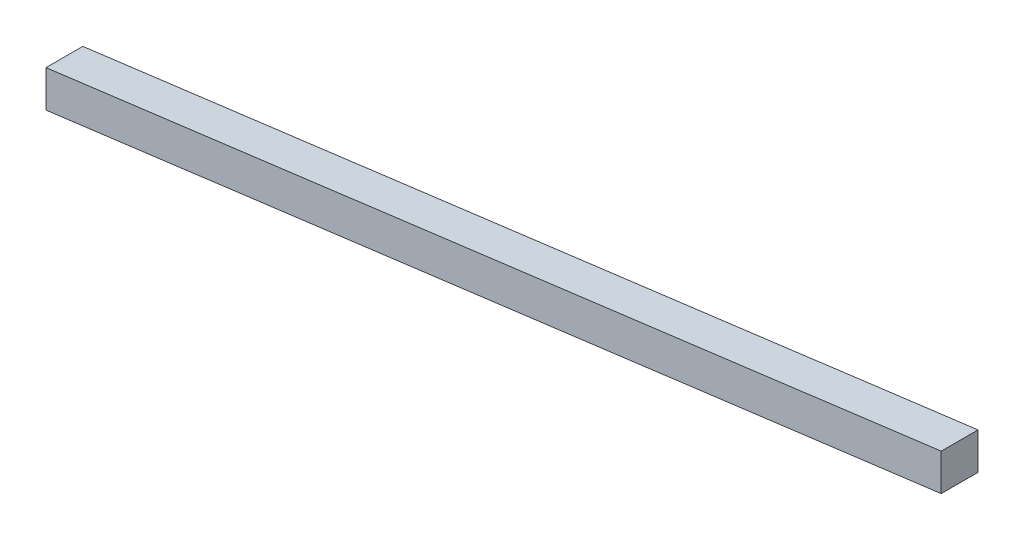
ISO-10303-21;
HEADER;
FILE_DESCRIPTION(('STEP AP214'),'2;1');
FILE_NAME('part.step','',(''),(''),'','','');
FILE_SCHEMA(('AUTOMOTIVE_DESIGN { 1 0 10303 214 1 1 1 1 }'));
ENDSEC;
DATA;
#1=APPLICATION_CONTEXT('core data for automotive mechanical design processes');
#2=APPLICATION_PROTOCOL_DEFINITION('international standard','automotive_design',2000,#1);
#3=PRODUCT_CONTEXT('',#1,'mechanical');
#4=PRODUCT('Part','Part','',(#3));
#5=PRODUCT_RELATED_PRODUCT_CATEGORY('part','',(#4));
#6=PRODUCT_DEFINITION_FORMATION('','',#4);
#7=PRODUCT_DEFINITION_CONTEXT('part definition',#1,'design');
#8=PRODUCT_DEFINITION('design','',#6,#7);
#9=PRODUCT_DEFINITION_SHAPE('','',#8);
#10=(LENGTH_UNIT() NAMED_UNIT(*) SI_UNIT(.MILLI.,.METRE.));
#11=(NAMED_UNIT(*) PLANE_ANGLE_UNIT() SI_UNIT($,.RADIAN.));
#12=(NAMED_UNIT(*) SI_UNIT($,.STERADIAN.) SOLID_ANGLE_UNIT());
#13=UNCERTAINTY_MEASURE_WITH_UNIT(LENGTH_MEASURE(1.E-05),#10,'distance_accuracy_value','');
#14=(GEOMETRIC_REPRESENTATION_CONTEXT(3) GLOBAL_UNCERTAINTY_ASSIGNED_CONTEXT((#13)) GLOBAL_UNIT_ASSIGNED_CONTEXT((#10,
#11,#12)) REPRESENTATION_CONTEXT('',''));
#15=CARTESIAN_POINT('',(0.,0.,0.));
#16=DIRECTION('',(0.,0.,1.));
#17=DIRECTION('',(1.,0.,0.));
#18=AXIS2_PLACEMENT_3D('',#15,#16,#17);
#19=CARTESIAN_POINT('',(73.0062499999999,12.4164000000002,6.));
#20=DIRECTION('',(-1.,0.,0.));
#21=DIRECTION('',(0.,0.,1.));
#22=AXIS2_PLACEMENT_3D('',#19,#20,#21);
#23=PLANE('',#22);
#24=DIRECTION('',(0.,1.,0.));
#25=VECTOR('',#24,1.);
#26=CARTESIAN_POINT('',(73.0062499999999,12.4164000000002,0.));
#27=LINE('',#26,#25);
#28=CARTESIAN_POINT('',(73.0062499999999,6.41640000000021,0.));
#29=VERTEX_POINT('',#28);
#30=CARTESIAN_POINT('',(73.0062499999999,12.4164000000002,0.));
#31=VERTEX_POINT('',#30);
#32=EDGE_CURVE('E113',#29,#31,#27,.T.);
#33=ORIENTED_EDGE('',*,*,#32,.T.);
#34=DIRECTION('',(0.,0.,-1.));
#35=VECTOR('',#34,1.);
#36=CARTESIAN_POINT('',(73.0062499999999,12.4164000000002,6.));
#37=LINE('',#36,#35);
#38=CARTESIAN_POINT('',(73.0062499999999,12.4164000000002,6.));
#39=VERTEX_POINT('',#38);
#40=EDGE_CURVE('E11',#39,#31,#37,.T.);
#41=ORIENTED_EDGE('',*,*,#40,.F.);
#42=DIRECTION('',(0.,1.,0.));
#43=VECTOR('',#42,1.);
#44=CARTESIAN_POINT('',(73.0062499999999,12.4164000000002,6.));
#45=LINE('',#44,#43);
#46=CARTESIAN_POINT('',(73.0062499999999,6.41640000000021,6.));
#47=VERTEX_POINT('',#46);
#48=EDGE_CURVE('E97',#47,#39,#45,.T.);
#49=ORIENTED_EDGE('',*,*,#48,.F.);
#50=DIRECTION('',(0.,0.,-1.));
#51=VECTOR('',#50,1.);
#52=CARTESIAN_POINT('',(73.0062499999999,6.41640000000021,6.));
#53=LINE('',#52,#51);
#54=EDGE_CURVE('E109',#47,#29,#53,.T.);
#55=ORIENTED_EDGE('',*,*,#54,.T.);
#56=EDGE_LOOP('',(#33,#41,#49,#55));
#57=FACE_BOUND('',#56,.T.);
#58=ADVANCED_FACE('F45',(#57),#23,.F.);
#59=CARTESIAN_POINT('',(-73.0062499999999,-6.41640000000021,6.));
#60=DIRECTION('',(0.127921077418863,-0.991784350527874,0.));
#61=DIRECTION('',(0.991784350527874,0.127921077418863,0.));
#62=AXIS2_PLACEMENT_3D('',#59,#60,#61);
#63=PLANE('',#62);
#64=DIRECTION('',(-0.991784350527874,-0.127921077418863,0.));
#65=VECTOR('',#64,1.);
#66=CARTESIAN_POINT('',(-73.0062499999999,-6.41640000000021,0.));
#67=LINE('',#66,#65);
#68=CARTESIAN_POINT('',(-73.0062499999999,-6.41640000000021,0.));
#69=VERTEX_POINT('',#68);
#70=EDGE_CURVE('E102',#31,#69,#67,.T.);
#71=ORIENTED_EDGE('',*,*,#70,.T.);
#72=DIRECTION('',(0.,0.,-1.));
#73=VECTOR('',#72,1.);
#74=CARTESIAN_POINT('',(-73.0062499999999,-6.41640000000021,6.));
#75=LINE('',#74,#73);
#76=CARTESIAN_POINT('',(-73.0062499999999,-6.41640000000021,6.));
#77=VERTEX_POINT('',#76);
#78=EDGE_CURVE('E54',#77,#69,#75,.T.);
#79=ORIENTED_EDGE('',*,*,#78,.F.);
#80=DIRECTION('',(-0.991784350527874,-0.127921077418863,0.));
#81=VECTOR('',#80,1.);
#82=CARTESIAN_POINT('',(-73.0062499999999,-6.41640000000021,6.));
#83=LINE('',#82,#81);
#84=EDGE_CURVE('E92',#39,#77,#83,.T.);
#85=ORIENTED_EDGE('',*,*,#84,.F.);
#86=ORIENTED_EDGE('',*,*,#40,.T.);
#87=EDGE_LOOP('',(#71,#79,#85,#86));
#88=FACE_BOUND('',#87,.T.);
#89=ADVANCED_FACE('F101',(#88),#63,.F.);
#90=CARTESIAN_POINT('',(-73.0062499999999,-12.4164000000002,6.));
#91=DIRECTION('',(1.,0.,0.));
#92=DIRECTION('',(0.,0.,-1.));
#93=AXIS2_PLACEMENT_3D('',#90,#91,#92);
#94=PLANE('',#93);
#95=DIRECTION('',(0.,-1.,0.));
#96=VECTOR('',#95,1.);
#97=CARTESIAN_POINT('',(-73.0062499999999,-12.4164000000002,0.));
#98=LINE('',#97,#96);
#99=CARTESIAN_POINT('',(-73.0062499999999,-12.4164000000002,0.));
#100=VERTEX_POINT('',#99);
#101=EDGE_CURVE('E79',#69,#100,#98,.T.);
#102=ORIENTED_EDGE('',*,*,#101,.T.);
#103=DIRECTION('',(0.,0.,-1.));
#104=VECTOR('',#103,1.);
#105=CARTESIAN_POINT('',(-73.0062499999999,-12.4164000000002,6.));
#106=LINE('',#105,#104);
#107=CARTESIAN_POINT('',(-73.0062499999999,-12.4164000000002,6.));
#108=VERTEX_POINT('',#107);
#109=EDGE_CURVE('E104',#108,#100,#106,.T.);
#110=ORIENTED_EDGE('',*,*,#109,.F.);
#111=DIRECTION('',(0.,-1.,0.));
#112=VECTOR('',#111,1.);
#113=CARTESIAN_POINT('',(-73.0062499999999,-12.4164000000002,6.));
#114=LINE('',#113,#112);
#115=EDGE_CURVE('E95',#77,#108,#114,.T.);
#116=ORIENTED_EDGE('',*,*,#115,.F.);
#117=ORIENTED_EDGE('',*,*,#78,.T.);
#118=EDGE_LOOP('',(#102,#110,#116,#117));
#119=FACE_BOUND('',#118,.T.);
#120=ADVANCED_FACE('F105',(#119),#94,.F.);
#121=CARTESIAN_POINT('',(-73.0062499999999,-12.4164000000002,6.));
#122=DIRECTION('',(-0.127921077418863,0.991784350527874,0.));
#123=DIRECTION('',(-0.991784350527874,-0.127921077418863,0.));
#124=AXIS2_PLACEMENT_3D('',#121,#122,#123);
#125=PLANE('',#124);
#126=DIRECTION('',(0.991784350527874,0.127921077418863,0.));
#127=VECTOR('',#126,1.);
#128=CARTESIAN_POINT('',(-73.0062499999999,-12.4164000000002,0.));
#129=LINE('',#128,#127);
#130=EDGE_CURVE('E85',#100,#29,#129,.T.);
#131=ORIENTED_EDGE('',*,*,#130,.T.);
#132=ORIENTED_EDGE('',*,*,#54,.F.);
#133=DIRECTION('',(0.991784350527874,0.127921077418863,0.));
#134=VECTOR('',#133,1.);
#135=CARTESIAN_POINT('',(-73.0062499999999,-12.4164000000002,6.));
#136=LINE('',#135,#134);
#137=EDGE_CURVE('E62',#108,#47,#136,.T.);
#138=ORIENTED_EDGE('',*,*,#137,.F.);
#139=ORIENTED_EDGE('',*,*,#109,.T.);
#140=EDGE_LOOP('',(#131,#132,#138,#139));
#141=FACE_BOUND('',#140,.T.);
#142=ADVANCED_FACE('F126',(#141),#125,.F.);
#143=CARTESIAN_POINT('',(0.,0.,6.));
#144=DIRECTION('',(0.,0.,1.));
#145=DIRECTION('',(1.,0.,0.));
#146=AXIS2_PLACEMENT_3D('',#143,#144,#145);
#147=PLANE('',#146);
#148=ORIENTED_EDGE('',*,*,#48,.T.);
#149=ORIENTED_EDGE('',*,*,#84,.T.);
#150=ORIENTED_EDGE('',*,*,#115,.T.);
#151=ORIENTED_EDGE('',*,*,#137,.T.);
#152=EDGE_LOOP('',(#148,#149,#150,#151));
#153=FACE_BOUND('',#152,.T.);
#154=ADVANCED_FACE('F93',(#153),#147,.T.);
#155=CARTESIAN_POINT('',(0.,0.,0.));
#156=DIRECTION('',(0.,0.,1.));
#157=DIRECTION('',(1.,0.,0.));
#158=AXIS2_PLACEMENT_3D('',#155,#156,#157);
#159=PLANE('',#158);
#160=ORIENTED_EDGE('',*,*,#32,.F.);
#161=ORIENTED_EDGE('',*,*,#130,.F.);
#162=ORIENTED_EDGE('',*,*,#101,.F.);
#163=ORIENTED_EDGE('',*,*,#70,.F.);
#164=EDGE_LOOP('',(#160,#161,#162,#163));
#165=FACE_BOUND('',#164,.T.);
#166=ADVANCED_FACE('F129',(#165),#159,.F.);
#167=CLOSED_SHELL('',(#58,#89,#120,#142,#154,#166));
#168=MANIFOLD_SOLID_BREP('B2',#167);
#169=ADVANCED_BREP_SHAPE_REPRESENTATION('',(#18,#168),#14);
#170=SHAPE_DEFINITION_REPRESENTATION(#9,#169);
ENDSEC;
END-ISO-10303-21;
